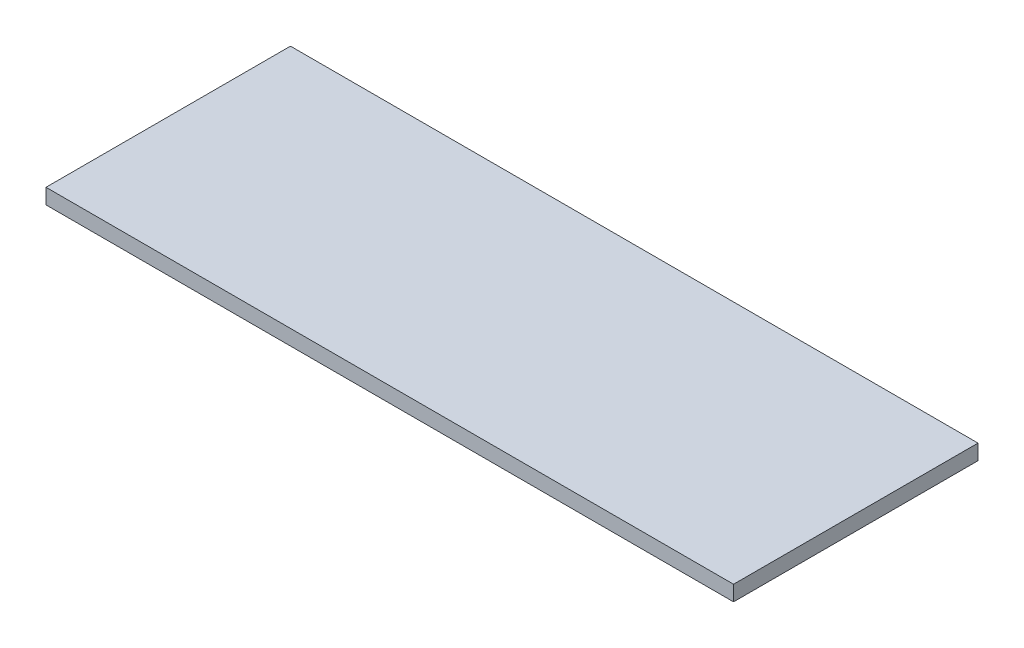
ISO-10303-21;
HEADER;
FILE_DESCRIPTION(('STEP AP214'),'2;1');
FILE_NAME('part.step','',(''),(''),'','','');
FILE_SCHEMA(('AUTOMOTIVE_DESIGN { 1 0 10303 214 1 1 1 1 }'));
ENDSEC;
DATA;
#1=APPLICATION_CONTEXT('core data for automotive mechanical design processes');
#2=APPLICATION_PROTOCOL_DEFINITION('international standard','automotive_design',2000,#1);
#3=PRODUCT_CONTEXT('',#1,'mechanical');
#4=PRODUCT('Part','Part','',(#3));
#5=PRODUCT_RELATED_PRODUCT_CATEGORY('part','',(#4));
#6=PRODUCT_DEFINITION_FORMATION('','',#4);
#7=PRODUCT_DEFINITION_CONTEXT('part definition',#1,'design');
#8=PRODUCT_DEFINITION('design','',#6,#7);
#9=PRODUCT_DEFINITION_SHAPE('','',#8);
#10=(LENGTH_UNIT() NAMED_UNIT(*) SI_UNIT(.MILLI.,.METRE.));
#11=(NAMED_UNIT(*) PLANE_ANGLE_UNIT() SI_UNIT($,.RADIAN.));
#12=(NAMED_UNIT(*) SI_UNIT($,.STERADIAN.) SOLID_ANGLE_UNIT());
#13=UNCERTAINTY_MEASURE_WITH_UNIT(LENGTH_MEASURE(1.E-05),#10,'distance_accuracy_value','');
#14=(GEOMETRIC_REPRESENTATION_CONTEXT(3) GLOBAL_UNCERTAINTY_ASSIGNED_CONTEXT((#13)) GLOBAL_UNIT_ASSIGNED_CONTEXT((#10,
#11,#12)) REPRESENTATION_CONTEXT('',''));
#15=CARTESIAN_POINT('',(0.,0.,0.));
#16=DIRECTION('',(0.,0.,1.));
#17=DIRECTION('',(1.,0.,0.));
#18=AXIS2_PLACEMENT_3D('',#15,#16,#17);
#19=CARTESIAN_POINT('',(-45.,2.,16.));
#20=DIRECTION('',(1.,0.,0.));
#21=DIRECTION('',(0.,0.,-1.));
#22=AXIS2_PLACEMENT_3D('',#19,#20,#21);
#23=PLANE('',#22);
#24=DIRECTION('',(0.,0.,1.));
#25=VECTOR('',#24,1.);
#26=CARTESIAN_POINT('',(-45.,0.,16.));
#27=LINE('',#26,#25);
#28=CARTESIAN_POINT('',(-45.,0.,-16.));
#29=VERTEX_POINT('',#28);
#30=CARTESIAN_POINT('',(-45.,0.,16.));
#31=VERTEX_POINT('',#30);
#32=EDGE_CURVE('E96',#29,#31,#27,.T.);
#33=ORIENTED_EDGE('',*,*,#32,.T.);
#34=DIRECTION('',(0.,-1.,0.));
#35=VECTOR('',#34,1.);
#36=CARTESIAN_POINT('',(-45.,2.,16.));
#37=LINE('',#36,#35);
#38=CARTESIAN_POINT('',(-45.,2.,16.));
#39=VERTEX_POINT('',#38);
#40=EDGE_CURVE('E11',#39,#31,#37,.T.);
#41=ORIENTED_EDGE('',*,*,#40,.F.);
#42=DIRECTION('',(0.,0.,1.));
#43=VECTOR('',#42,1.);
#44=CARTESIAN_POINT('',(-45.,2.,16.));
#45=LINE('',#44,#43);
#46=CARTESIAN_POINT('',(-45.,2.,-16.));
#47=VERTEX_POINT('',#46);
#48=EDGE_CURVE('E84',#47,#39,#45,.T.);
#49=ORIENTED_EDGE('',*,*,#48,.F.);
#50=DIRECTION('',(0.,-1.,0.));
#51=VECTOR('',#50,1.);
#52=CARTESIAN_POINT('',(-45.,2.,-16.));
#53=LINE('',#52,#51);
#54=EDGE_CURVE('E92',#47,#29,#53,.T.);
#55=ORIENTED_EDGE('',*,*,#54,.T.);
#56=EDGE_LOOP('',(#33,#41,#49,#55));
#57=FACE_BOUND('',#56,.T.);
#58=ADVANCED_FACE('F33',(#57),#23,.F.);
#59=CARTESIAN_POINT('',(45.,2.,16.));
#60=DIRECTION('',(0.,0.,-1.));
#61=DIRECTION('',(-1.,0.,0.));
#62=AXIS2_PLACEMENT_3D('',#59,#60,#61);
#63=PLANE('',#62);
#64=DIRECTION('',(1.,0.,0.));
#65=VECTOR('',#64,1.);
#66=CARTESIAN_POINT('',(45.,0.,16.));
#67=LINE('',#66,#65);
#68=CARTESIAN_POINT('',(45.,0.,16.));
#69=VERTEX_POINT('',#68);
#70=EDGE_CURVE('E88',#31,#69,#67,.T.);
#71=ORIENTED_EDGE('',*,*,#70,.T.);
#72=DIRECTION('',(0.,-1.,0.));
#73=VECTOR('',#72,1.);
#74=CARTESIAN_POINT('',(45.,2.,16.));
#75=LINE('',#74,#73);
#76=CARTESIAN_POINT('',(45.,2.,16.));
#77=VERTEX_POINT('',#76);
#78=EDGE_CURVE('E41',#77,#69,#75,.T.);
#79=ORIENTED_EDGE('',*,*,#78,.F.);
#80=DIRECTION('',(1.,0.,0.));
#81=VECTOR('',#80,1.);
#82=CARTESIAN_POINT('',(45.,2.,16.));
#83=LINE('',#82,#81);
#84=EDGE_CURVE('E79',#39,#77,#83,.T.);
#85=ORIENTED_EDGE('',*,*,#84,.F.);
#86=ORIENTED_EDGE('',*,*,#40,.T.);
#87=EDGE_LOOP('',(#71,#79,#85,#86));
#88=FACE_BOUND('',#87,.T.);
#89=ADVANCED_FACE('F87',(#88),#63,.F.);
#90=CARTESIAN_POINT('',(45.,2.,16.));
#91=DIRECTION('',(-1.,0.,0.));
#92=DIRECTION('',(0.,0.,1.));
#93=AXIS2_PLACEMENT_3D('',#90,#91,#92);
#94=PLANE('',#93);
#95=DIRECTION('',(0.,0.,-1.));
#96=VECTOR('',#95,1.);
#97=CARTESIAN_POINT('',(45.,0.,16.));
#98=LINE('',#97,#96);
#99=CARTESIAN_POINT('',(45.,0.,-16.));
#100=VERTEX_POINT('',#99);
#101=EDGE_CURVE('E66',#69,#100,#98,.T.);
#102=ORIENTED_EDGE('',*,*,#101,.T.);
#103=DIRECTION('',(0.,-1.,0.));
#104=VECTOR('',#103,1.);
#105=CARTESIAN_POINT('',(45.,2.,-16.));
#106=LINE('',#105,#104);
#107=CARTESIAN_POINT('',(45.,2.,-16.));
#108=VERTEX_POINT('',#107);
#109=EDGE_CURVE('E89',#108,#100,#106,.T.);
#110=ORIENTED_EDGE('',*,*,#109,.F.);
#111=DIRECTION('',(0.,0.,-1.));
#112=VECTOR('',#111,1.);
#113=CARTESIAN_POINT('',(45.,2.,16.));
#114=LINE('',#113,#112);
#115=EDGE_CURVE('E82',#77,#108,#114,.T.);
#116=ORIENTED_EDGE('',*,*,#115,.F.);
#117=ORIENTED_EDGE('',*,*,#78,.T.);
#118=EDGE_LOOP('',(#102,#110,#116,#117));
#119=FACE_BOUND('',#118,.T.);
#120=ADVANCED_FACE('F90',(#119),#94,.F.);
#121=CARTESIAN_POINT('',(45.,2.,-16.));
#122=DIRECTION('',(0.,0.,1.));
#123=DIRECTION('',(1.,0.,0.));
#124=AXIS2_PLACEMENT_3D('',#121,#122,#123);
#125=PLANE('',#124);
#126=DIRECTION('',(-1.,0.,0.));
#127=VECTOR('',#126,1.);
#128=CARTESIAN_POINT('',(45.,0.,-16.));
#129=LINE('',#128,#127);
#130=EDGE_CURVE('E72',#100,#29,#129,.T.);
#131=ORIENTED_EDGE('',*,*,#130,.T.);
#132=ORIENTED_EDGE('',*,*,#54,.F.);
#133=DIRECTION('',(-1.,0.,0.));
#134=VECTOR('',#133,1.);
#135=CARTESIAN_POINT('',(45.,2.,-16.));
#136=LINE('',#135,#134);
#137=EDGE_CURVE('E49',#108,#47,#136,.T.);
#138=ORIENTED_EDGE('',*,*,#137,.F.);
#139=ORIENTED_EDGE('',*,*,#109,.T.);
#140=EDGE_LOOP('',(#131,#132,#138,#139));
#141=FACE_BOUND('',#140,.T.);
#142=ADVANCED_FACE('F103',(#141),#125,.F.);
#143=CARTESIAN_POINT('',(0.,2.,0.));
#144=DIRECTION('',(0.,1.,0.));
#145=DIRECTION('',(0.,0.,1.));
#146=AXIS2_PLACEMENT_3D('',#143,#144,#145);
#147=PLANE('',#146);
#148=ORIENTED_EDGE('',*,*,#48,.T.);
#149=ORIENTED_EDGE('',*,*,#84,.T.);
#150=ORIENTED_EDGE('',*,*,#115,.T.);
#151=ORIENTED_EDGE('',*,*,#137,.T.);
#152=EDGE_LOOP('',(#148,#149,#150,#151));
#153=FACE_BOUND('',#152,.T.);
#154=ADVANCED_FACE('F80',(#153),#147,.T.);
#155=CARTESIAN_POINT('',(0.,0.,0.));
#156=DIRECTION('',(0.,1.,0.));
#157=DIRECTION('',(0.,0.,1.));
#158=AXIS2_PLACEMENT_3D('',#155,#156,#157);
#159=PLANE('',#158);
#160=ORIENTED_EDGE('',*,*,#32,.F.);
#161=ORIENTED_EDGE('',*,*,#130,.F.);
#162=ORIENTED_EDGE('',*,*,#101,.F.);
#163=ORIENTED_EDGE('',*,*,#70,.F.);
#164=EDGE_LOOP('',(#160,#161,#162,#163));
#165=FACE_BOUND('',#164,.T.);
#166=ADVANCED_FACE('F106',(#165),#159,.F.);
#167=CLOSED_SHELL('',(#58,#89,#120,#142,#154,#166));
#168=MANIFOLD_SOLID_BREP('B2',#167);
#169=ADVANCED_BREP_SHAPE_REPRESENTATION('',(#18,#168),#14);
#170=SHAPE_DEFINITION_REPRESENTATION(#9,#169);
ENDSEC;
END-ISO-10303-21;
